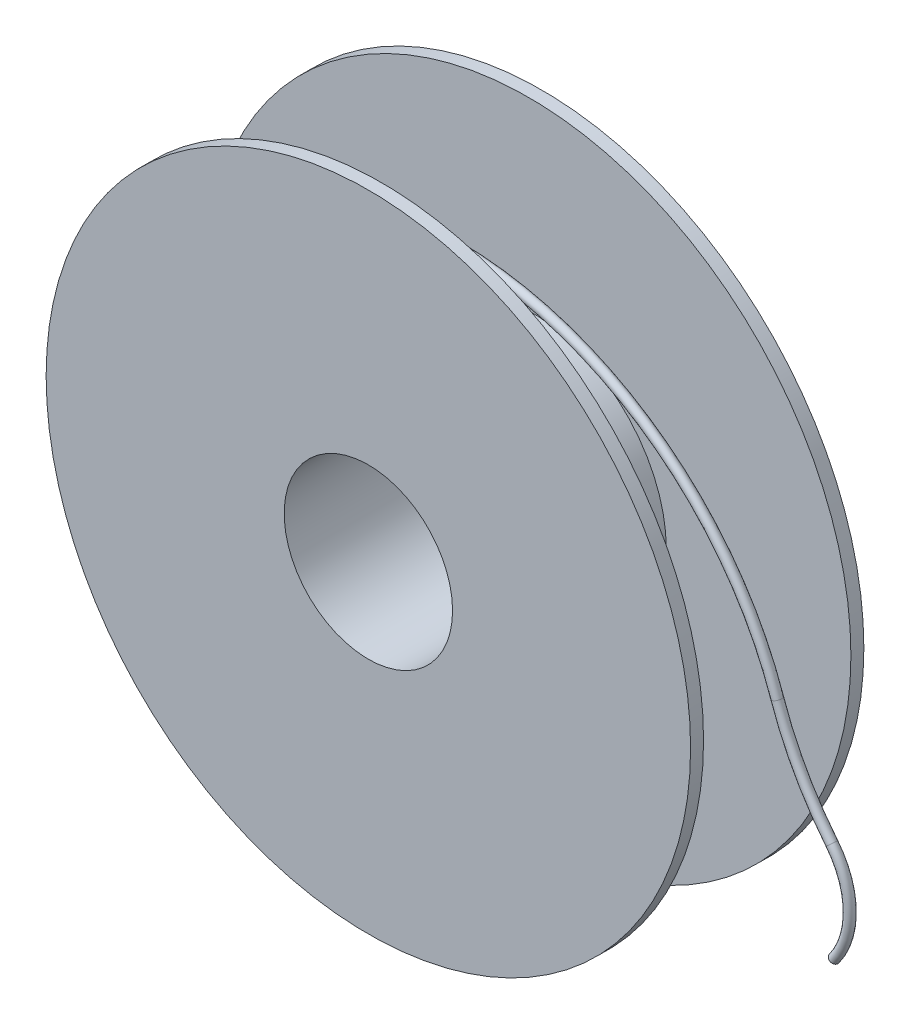
ISO-10303-21;
HEADER;
FILE_DESCRIPTION(('STEP AP214'),'2;1');
FILE_NAME('part.step','',(''),(''),'','','');
FILE_SCHEMA(('AUTOMOTIVE_DESIGN { 1 0 10303 214 1 1 1 1 }'));
ENDSEC;
DATA;
#1=APPLICATION_CONTEXT('core data for automotive mechanical design processes');
#2=APPLICATION_PROTOCOL_DEFINITION('international standard','automotive_design',2000,#1);
#3=PRODUCT_CONTEXT('',#1,'mechanical');
#4=PRODUCT('Part','Part','',(#3));
#5=PRODUCT_RELATED_PRODUCT_CATEGORY('part','',(#4));
#6=PRODUCT_DEFINITION_FORMATION('','',#4);
#7=PRODUCT_DEFINITION_CONTEXT('part definition',#1,'design');
#8=PRODUCT_DEFINITION('design','',#6,#7);
#9=PRODUCT_DEFINITION_SHAPE('','',#8);
#10=(LENGTH_UNIT() NAMED_UNIT(*) SI_UNIT(.MILLI.,.METRE.));
#11=(NAMED_UNIT(*) PLANE_ANGLE_UNIT() SI_UNIT($,.RADIAN.));
#12=(NAMED_UNIT(*) SI_UNIT($,.STERADIAN.) SOLID_ANGLE_UNIT());
#13=UNCERTAINTY_MEASURE_WITH_UNIT(LENGTH_MEASURE(1.E-05),#10,'distance_accuracy_value','');
#14=(GEOMETRIC_REPRESENTATION_CONTEXT(3) GLOBAL_UNCERTAINTY_ASSIGNED_CONTEXT((#13)) GLOBAL_UNIT_ASSIGNED_CONTEXT((#10,
#11,#12)) REPRESENTATION_CONTEXT('',''));
#15=CARTESIAN_POINT('',(0.,0.,0.));
#16=DIRECTION('',(0.,0.,1.));
#17=DIRECTION('',(1.,0.,0.));
#18=AXIS2_PLACEMENT_3D('',#15,#16,#17);
#19=CARTESIAN_POINT('',(-42.5,0.,0.));
#20=DIRECTION('',(-1.,0.,0.));
#21=DIRECTION('',(0.,0.,1.));
#22=AXIS2_PLACEMENT_3D('',#19,#20,#21);
#23=PLANE('',#22);
#24=CARTESIAN_POINT('',(-42.5,0.,0.));
#25=DIRECTION('',(-1.,0.,0.));
#26=DIRECTION('',(0.,0.,1.));
#27=AXIS2_PLACEMENT_3D('',#24,#25,#26);
#28=CIRCLE('',#27,1.425);
#29=CARTESIAN_POINT('',(-42.5,-1.425,0.));
#30=VERTEX_POINT('',#29);
#31=EDGE_CURVE('E61',#30,#30,#28,.T.);
#32=ORIENTED_EDGE('',*,*,#31,.F.);
#33=EDGE_LOOP('',(#32));
#34=FACE_BOUND('',#33,.T.);
#35=ADVANCED_FACE('F39',(#34),#23,.F.);
#36=CARTESIAN_POINT('',(117.111892834051,-60.8092826879135,0.));
#37=DIRECTION('',(-0.588079841741512,-0.808802880643533,0.));
#38=DIRECTION('',(0.,0.,1.));
#39=AXIS2_PLACEMENT_3D('',#36,#37,#38);
#40=PLANE('',#39);
#41=CARTESIAN_POINT('',(117.111892834051,-60.8092826879135,0.));
#42=DIRECTION('',(-0.588079841741512,-0.808802880643533,0.));
#43=DIRECTION('',(0.,0.,1.));
#44=AXIS2_PLACEMENT_3D('',#41,#42,#43);
#45=CIRCLE('',#44,1.425);
#46=CARTESIAN_POINT('',(118.264436938968,-61.6472964623952,0.));
#47=VERTEX_POINT('',#46);
#48=EDGE_CURVE('E11',#47,#47,#45,.T.);
#49=ORIENTED_EDGE('',*,*,#48,.T.);
#50=EDGE_LOOP('',(#49));
#51=FACE_BOUND('',#50,.T.);
#52=ADVANCED_FACE('F68',(#51),#40,.T.);
#53=CARTESIAN_POINT('',(-42.5,14.25,0.));
#54=DIRECTION('',(0.,0.,-1.));
#55=DIRECTION('',(-1.,0.,0.));
#56=AXIS2_PLACEMENT_3D('',#53,#54,#55);
#57=TOROIDAL_SURFACE('',#56,14.25,1.425);
#58=CARTESIAN_POINT('',(-56.75,14.25,0.));
#59=DIRECTION('',(0.,1.,0.));
#60=DIRECTION('',(0.,0.,1.));
#61=AXIS2_PLACEMENT_3D('',#58,#59,#60);
#62=CIRCLE('',#61,1.425);
#63=CARTESIAN_POINT('',(-58.175,14.25,0.));
#64=VERTEX_POINT('',#63);
#65=EDGE_CURVE('E58',#64,#64,#62,.T.);
#66=CARTESIAN_POINT('',(-42.5,14.25,0.));
#67=DIRECTION('',(0.,0.,-1.));
#68=DIRECTION('',(-1.,0.,0.));
#69=AXIS2_PLACEMENT_3D('',#66,#67,#68);
#70=CIRCLE('',#69,15.675);
#71=EDGE_CURVE('',#30,#64,#70,.T.);
#72=ORIENTED_EDGE('',*,*,#31,.T.);
#73=ORIENTED_EDGE('',*,*,#65,.F.);
#74=ORIENTED_EDGE('',*,*,#71,.T.);
#75=ORIENTED_EDGE('',*,*,#71,.F.);
#76=EDGE_LOOP('',(#72,#74,#73,#75));
#77=FACE_BOUND('',#76,.T.);
#78=ADVANCED_FACE('F65',(#77),#57,.T.);
#79=CARTESIAN_POINT('',(0.,14.25,0.));
#80=DIRECTION('',(0.,0.,-1.));
#81=DIRECTION('',(-1.,0.,0.));
#82=AXIS2_PLACEMENT_3D('',#79,#80,#81);
#83=TOROIDAL_SURFACE('',#82,56.75,1.425);
#84=CARTESIAN_POINT('',(0.,71.,0.));
#85=DIRECTION('',(1.,0.,0.));
#86=DIRECTION('',(0.,0.,1.));
#87=AXIS2_PLACEMENT_3D('',#84,#85,#86);
#88=CIRCLE('',#87,1.425);
#89=CARTESIAN_POINT('',(0.,72.425,0.));
#90=VERTEX_POINT('',#89);
#91=EDGE_CURVE('E53',#90,#90,#88,.T.);
#92=CARTESIAN_POINT('',(0.,14.25,0.));
#93=DIRECTION('',(0.,0.,-1.));
#94=DIRECTION('',(-1.,0.,0.));
#95=AXIS2_PLACEMENT_3D('',#92,#93,#94);
#96=CIRCLE('',#95,58.175);
#97=EDGE_CURVE('',#64,#90,#96,.T.);
#98=ORIENTED_EDGE('',*,*,#65,.T.);
#99=ORIENTED_EDGE('',*,*,#91,.F.);
#100=ORIENTED_EDGE('',*,*,#97,.T.);
#101=ORIENTED_EDGE('',*,*,#97,.F.);
#102=EDGE_LOOP('',(#98,#100,#99,#101));
#103=FACE_BOUND('',#102,.T.);
#104=ADVANCED_FACE('F86',(#103),#83,.T.);
#105=CARTESIAN_POINT('',(0.,-34.2200704225352,0.));
#106=DIRECTION('',(0.,0.,-1.));
#107=DIRECTION('',(-1.,0.,0.));
#108=AXIS2_PLACEMENT_3D('',#105,#106,#107);
#109=TOROIDAL_SURFACE('',#108,105.220070422535,1.425);
#110=CARTESIAN_POINT('',(99.5,0.,0.));
#111=DIRECTION('',(0.325223793189994,-0.945637078557684,0.));
#112=DIRECTION('',(0.,0.,1.));
#113=AXIS2_PLACEMENT_3D('',#110,#111,#112);
#114=CIRCLE('',#113,1.425);
#115=CARTESIAN_POINT('',(100.847532836945,0.463443905295735,0.));
#116=VERTEX_POINT('',#115);
#117=EDGE_CURVE('E49',#116,#116,#114,.T.);
#118=CARTESIAN_POINT('',(0.,-34.2200704225352,0.));
#119=DIRECTION('',(0.,0.,-1.));
#120=DIRECTION('',(-1.,0.,0.));
#121=AXIS2_PLACEMENT_3D('',#118,#119,#120);
#122=CIRCLE('',#121,106.645070422535);
#123=EDGE_CURVE('',#90,#116,#122,.T.);
#124=ORIENTED_EDGE('',*,*,#91,.T.);
#125=ORIENTED_EDGE('',*,*,#117,.F.);
#126=ORIENTED_EDGE('',*,*,#123,.T.);
#127=ORIENTED_EDGE('',*,*,#123,.F.);
#128=EDGE_LOOP('',(#124,#126,#125,#127));
#129=FACE_BOUND('',#128,.T.);
#130=ADVANCED_FACE('F80',(#129),#109,.T.);
#131=CARTESIAN_POINT('',(194.063707855768,32.5223793189994,0.));
#132=DIRECTION('',(0.,0.,1.));
#133=DIRECTION('',(1.,0.,0.));
#134=AXIS2_PLACEMENT_3D('',#131,#132,#133);
#135=TOROIDAL_SURFACE('',#134,100.,1.425);
#136=CARTESIAN_POINT('',(116.326198225524,-30.3813534517006,0.));
#137=DIRECTION('',(0.629037327707,-0.777375096302446,0.));
#138=DIRECTION('',(0.,0.,1.));
#139=AXIS2_PLACEMENT_3D('',#136,#137,#138);
#140=CIRCLE('',#139,1.425);
#141=CARTESIAN_POINT('',(117.433957737755,-29.4849752597181,0.));
#142=VERTEX_POINT('',#141);
#143=EDGE_CURVE('E45',#142,#142,#140,.T.);
#144=ORIENTED_EDGE('',*,*,#143,.F.);
#145=EDGE_LOOP('',(#144));
#146=FACE_BOUND('',#145,.T.);
#147=ORIENTED_EDGE('',*,*,#117,.T.);
#148=EDGE_LOOP('',(#147));
#149=FACE_BOUND('',#148,.T.);
#150=ADVANCED_FACE('F74',(#146,#149),#135,.T.);
#151=CARTESIAN_POINT('',(96.8918208179628,-46.1072866443757,0.));
#152=DIRECTION('',(0.,0.,-1.));
#153=DIRECTION('',(-1.,0.,0.));
#154=AXIS2_PLACEMENT_3D('',#151,#152,#153);
#155=TOROIDAL_SURFACE('',#154,25.,1.425);
#156=CARTESIAN_POINT('',(96.8918208179628,-46.1072866443757,0.));
#157=DIRECTION('',(0.,0.,-1.));
#158=DIRECTION('',(-1.,0.,0.));
#159=AXIS2_PLACEMENT_3D('',#156,#157,#158);
#160=CIRCLE('',#159,26.425);
#161=EDGE_CURVE('',#142,#47,#160,.T.);
#162=ORIENTED_EDGE('',*,*,#143,.T.);
#163=ORIENTED_EDGE('',*,*,#48,.F.);
#164=ORIENTED_EDGE('',*,*,#161,.T.);
#165=ORIENTED_EDGE('',*,*,#161,.F.);
#166=EDGE_LOOP('',(#162,#164,#163,#165));
#167=FACE_BOUND('',#166,.T.);
#168=ADVANCED_FACE('F72',(#167),#155,.T.);
#169=CLOSED_SHELL('',(#35,#52,#78,#104,#130,#150,#168));
#170=MANIFOLD_SOLID_BREP('B2',#169);
#171=CARTESIAN_POINT('',(0.,0.,0.));
#172=DIRECTION('',(0.,0.,1.));
#173=DIRECTION('',(1.,0.,0.));
#174=AXIS2_PLACEMENT_3D('',#171,#172,#173);
#175=CYLINDRICAL_SURFACE('',#174,26.);
#176=CARTESIAN_POINT('',(0.,0.,26.75));
#177=DIRECTION('',(0.,0.,1.));
#178=DIRECTION('',(1.,0.,0.));
#179=AXIS2_PLACEMENT_3D('',#176,#177,#178);
#180=CIRCLE('',#179,26.);
#181=CARTESIAN_POINT('',(26.,0.,26.75));
#182=VERTEX_POINT('',#181);
#183=EDGE_CURVE('E168',#182,#182,#180,.T.);
#184=ORIENTED_EDGE('',*,*,#183,.T.);
#185=EDGE_LOOP('',(#184));
#186=FACE_BOUND('',#185,.T.);
#187=CARTESIAN_POINT('',(0.,0.,-26.75));
#188=DIRECTION('',(0.,0.,1.));
#189=DIRECTION('',(1.,0.,0.));
#190=AXIS2_PLACEMENT_3D('',#187,#188,#189);
#191=CIRCLE('',#190,26.);
#192=CARTESIAN_POINT('',(26.,0.,-26.75));
#193=VERTEX_POINT('',#192);
#194=EDGE_CURVE('E38',#193,#193,#191,.T.);
#195=ORIENTED_EDGE('',*,*,#194,.F.);
#196=EDGE_LOOP('',(#195));
#197=FACE_BOUND('',#196,.T.);
#198=ADVANCED_FACE('F140',(#186,#197),#175,.F.);
#199=CARTESIAN_POINT('',(26.,0.,-26.75));
#200=DIRECTION('',(0.,0.,-1.));
#201=DIRECTION('',(-1.,0.,0.));
#202=AXIS2_PLACEMENT_3D('',#199,#200,#201);
#203=PLANE('',#202);
#204=ORIENTED_EDGE('',*,*,#194,.T.);
#205=EDGE_LOOP('',(#204));
#206=FACE_BOUND('',#205,.T.);
#207=CARTESIAN_POINT('',(0.,0.,-26.75));
#208=DIRECTION('',(0.,0.,1.));
#209=DIRECTION('',(1.,0.,0.));
#210=AXIS2_PLACEMENT_3D('',#207,#208,#209);
#211=CIRCLE('',#210,99.5);
#212=CARTESIAN_POINT('',(99.5,0.,-26.75));
#213=VERTEX_POINT('',#212);
#214=EDGE_CURVE('E146',#213,#213,#211,.T.);
#215=ORIENTED_EDGE('',*,*,#214,.F.);
#216=EDGE_LOOP('',(#215));
#217=FACE_BOUND('',#216,.T.);
#218=ADVANCED_FACE('F186',(#206,#217),#203,.T.);
#219=CARTESIAN_POINT('',(0.,0.,0.));
#220=DIRECTION('',(0.,0.,1.));
#221=DIRECTION('',(1.,0.,0.));
#222=AXIS2_PLACEMENT_3D('',#219,#220,#221);
#223=CYLINDRICAL_SURFACE('',#222,99.5);
#224=ORIENTED_EDGE('',*,*,#214,.T.);
#225=EDGE_LOOP('',(#224));
#226=FACE_BOUND('',#225,.T.);
#227=CARTESIAN_POINT('',(0.,0.,-22.75));
#228=DIRECTION('',(0.,0.,1.));
#229=DIRECTION('',(1.,0.,0.));
#230=AXIS2_PLACEMENT_3D('',#227,#228,#229);
#231=CIRCLE('',#230,99.5);
#232=CARTESIAN_POINT('',(99.5,0.,-22.75));
#233=VERTEX_POINT('',#232);
#234=EDGE_CURVE('E150',#233,#233,#231,.T.);
#235=ORIENTED_EDGE('',*,*,#234,.F.);
#236=EDGE_LOOP('',(#235));
#237=FACE_BOUND('',#236,.T.);
#238=ADVANCED_FACE('F190',(#226,#237),#223,.T.);
#239=CARTESIAN_POINT('',(99.5,0.,-22.75));
#240=DIRECTION('',(0.,0.,1.));
#241=DIRECTION('',(1.,0.,0.));
#242=AXIS2_PLACEMENT_3D('',#239,#240,#241);
#243=PLANE('',#242);
#244=ORIENTED_EDGE('',*,*,#234,.T.);
#245=EDGE_LOOP('',(#244));
#246=FACE_BOUND('',#245,.T.);
#247=CARTESIAN_POINT('',(0.,0.,-22.75));
#248=DIRECTION('',(0.,0.,1.));
#249=DIRECTION('',(1.,0.,0.));
#250=AXIS2_PLACEMENT_3D('',#247,#248,#249);
#251=CIRCLE('',#250,42.5);
#252=CARTESIAN_POINT('',(42.5,0.,-22.75));
#253=VERTEX_POINT('',#252);
#254=EDGE_CURVE('E154',#253,#253,#251,.T.);
#255=ORIENTED_EDGE('',*,*,#254,.F.);
#256=EDGE_LOOP('',(#255));
#257=FACE_BOUND('',#256,.T.);
#258=ADVANCED_FACE('F194',(#246,#257),#243,.T.);
#259=CARTESIAN_POINT('',(0.,0.,0.));
#260=DIRECTION('',(0.,0.,1.));
#261=DIRECTION('',(1.,0.,0.));
#262=AXIS2_PLACEMENT_3D('',#259,#260,#261);
#263=CYLINDRICAL_SURFACE('',#262,42.5);
#264=ORIENTED_EDGE('',*,*,#254,.T.);
#265=EDGE_LOOP('',(#264));
#266=FACE_BOUND('',#265,.T.);
#267=CARTESIAN_POINT('',(0.,0.,22.75));
#268=DIRECTION('',(0.,0.,1.));
#269=DIRECTION('',(1.,0.,0.));
#270=AXIS2_PLACEMENT_3D('',#267,#268,#269);
#271=CIRCLE('',#270,42.5);
#272=CARTESIAN_POINT('',(42.5,0.,22.75));
#273=VERTEX_POINT('',#272);
#274=EDGE_CURVE('E159',#273,#273,#271,.T.);
#275=ORIENTED_EDGE('',*,*,#274,.F.);
#276=EDGE_LOOP('',(#275));
#277=FACE_BOUND('',#276,.T.);
#278=ADVANCED_FACE('F200',(#266,#277),#263,.T.);
#279=CARTESIAN_POINT('',(42.5,0.,22.75));
#280=DIRECTION('',(0.,0.,-1.));
#281=DIRECTION('',(-1.,0.,0.));
#282=AXIS2_PLACEMENT_3D('',#279,#280,#281);
#283=PLANE('',#282);
#284=ORIENTED_EDGE('',*,*,#274,.T.);
#285=EDGE_LOOP('',(#284));
#286=FACE_BOUND('',#285,.T.);
#287=CARTESIAN_POINT('',(0.,0.,22.75));
#288=DIRECTION('',(0.,0.,1.));
#289=DIRECTION('',(1.,0.,0.));
#290=AXIS2_PLACEMENT_3D('',#287,#288,#289);
#291=CIRCLE('',#290,99.5);
#292=CARTESIAN_POINT('',(99.5,0.,22.75));
#293=VERTEX_POINT('',#292);
#294=EDGE_CURVE('E162',#293,#293,#291,.T.);
#295=ORIENTED_EDGE('',*,*,#294,.F.);
#296=EDGE_LOOP('',(#295));
#297=FACE_BOUND('',#296,.T.);
#298=ADVANCED_FACE('F182',(#286,#297),#283,.T.);
#299=CARTESIAN_POINT('',(0.,0.,0.));
#300=DIRECTION('',(0.,0.,1.));
#301=DIRECTION('',(1.,0.,0.));
#302=AXIS2_PLACEMENT_3D('',#299,#300,#301);
#303=CYLINDRICAL_SURFACE('',#302,99.5);
#304=ORIENTED_EDGE('',*,*,#294,.T.);
#305=EDGE_LOOP('',(#304));
#306=FACE_BOUND('',#305,.T.);
#307=CARTESIAN_POINT('',(0.,0.,26.75));
#308=DIRECTION('',(0.,0.,1.));
#309=DIRECTION('',(1.,0.,0.));
#310=AXIS2_PLACEMENT_3D('',#307,#308,#309);
#311=CIRCLE('',#310,99.5);
#312=CARTESIAN_POINT('',(99.5,0.,26.75));
#313=VERTEX_POINT('',#312);
#314=EDGE_CURVE('E165',#313,#313,#311,.T.);
#315=ORIENTED_EDGE('',*,*,#314,.F.);
#316=EDGE_LOOP('',(#315));
#317=FACE_BOUND('',#316,.T.);
#318=ADVANCED_FACE('F176',(#306,#317),#303,.T.);
#319=CARTESIAN_POINT('',(26.,0.,26.75));
#320=DIRECTION('',(0.,0.,1.));
#321=DIRECTION('',(1.,0.,0.));
#322=AXIS2_PLACEMENT_3D('',#319,#320,#321);
#323=PLANE('',#322);
#324=ORIENTED_EDGE('',*,*,#314,.T.);
#325=EDGE_LOOP('',(#324));
#326=FACE_BOUND('',#325,.T.);
#327=ORIENTED_EDGE('',*,*,#183,.F.);
#328=EDGE_LOOP('',(#327));
#329=FACE_BOUND('',#328,.T.);
#330=ADVANCED_FACE('F174',(#326,#329),#323,.T.);
#331=CLOSED_SHELL('',(#198,#218,#238,#258,#278,#298,#318,#330));
#332=MANIFOLD_SOLID_BREP('B6',#331);
#333=ADVANCED_BREP_SHAPE_REPRESENTATION('',(#18,#170,#332),#14);
#334=SHAPE_DEFINITION_REPRESENTATION(#9,#333);
ENDSEC;
END-ISO-10303-21;
